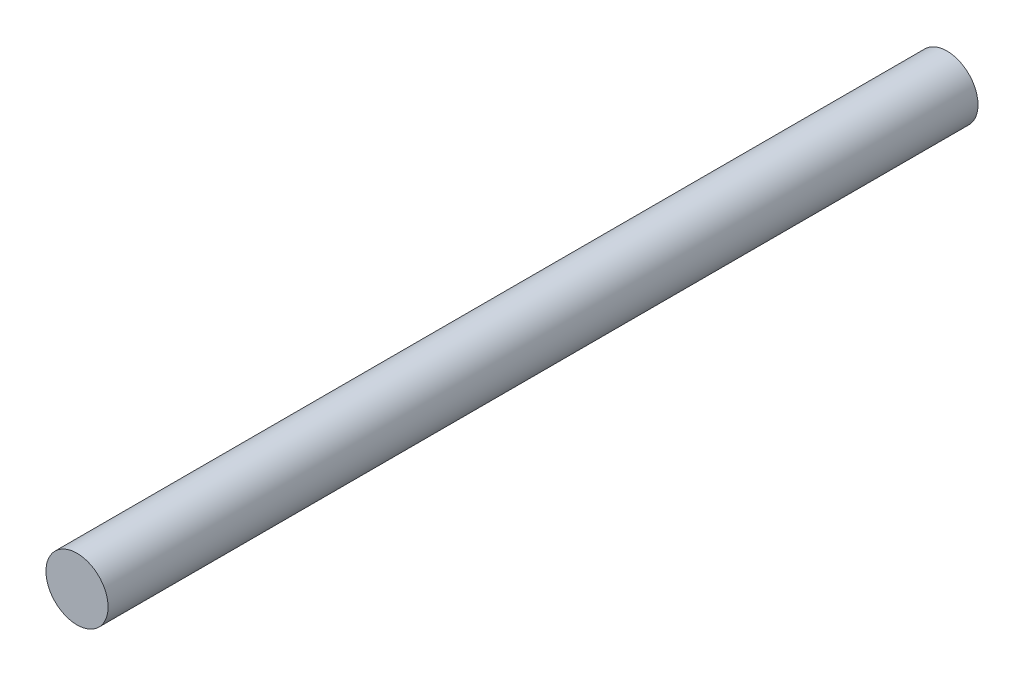
ISO-10303-21;
HEADER;
FILE_DESCRIPTION(('STEP AP214'),'2;1');
FILE_NAME('part.step','',(''),(''),'','','');
FILE_SCHEMA(('AUTOMOTIVE_DESIGN { 1 0 10303 214 1 1 1 1 }'));
ENDSEC;
DATA;
#1=APPLICATION_CONTEXT('core data for automotive mechanical design processes');
#2=APPLICATION_PROTOCOL_DEFINITION('international standard','automotive_design',2000,#1);
#3=PRODUCT_CONTEXT('',#1,'mechanical');
#4=PRODUCT('Part','Part','',(#3));
#5=PRODUCT_RELATED_PRODUCT_CATEGORY('part','',(#4));
#6=PRODUCT_DEFINITION_FORMATION('','',#4);
#7=PRODUCT_DEFINITION_CONTEXT('part definition',#1,'design');
#8=PRODUCT_DEFINITION('design','',#6,#7);
#9=PRODUCT_DEFINITION_SHAPE('','',#8);
#10=(LENGTH_UNIT() NAMED_UNIT(*) SI_UNIT(.MILLI.,.METRE.));
#11=(NAMED_UNIT(*) PLANE_ANGLE_UNIT() SI_UNIT($,.RADIAN.));
#12=(NAMED_UNIT(*) SI_UNIT($,.STERADIAN.) SOLID_ANGLE_UNIT());
#13=UNCERTAINTY_MEASURE_WITH_UNIT(LENGTH_MEASURE(1.E-05),#10,'distance_accuracy_value','');
#14=(GEOMETRIC_REPRESENTATION_CONTEXT(3) GLOBAL_UNCERTAINTY_ASSIGNED_CONTEXT((#13)) GLOBAL_UNIT_ASSIGNED_CONTEXT((#10,
#11,#12)) REPRESENTATION_CONTEXT('',''));
#15=CARTESIAN_POINT('',(0.,0.,0.));
#16=DIRECTION('',(0.,0.,1.));
#17=DIRECTION('',(1.,0.,0.));
#18=AXIS2_PLACEMENT_3D('',#15,#16,#17);
#19=CARTESIAN_POINT('',(0.,0.,35.));
#20=DIRECTION('',(0.,0.,-1.));
#21=DIRECTION('',(-1.,0.,0.));
#22=AXIS2_PLACEMENT_3D('',#19,#20,#21);
#23=CYLINDRICAL_SURFACE('',#22,2.5);
#24=CARTESIAN_POINT('',(0.,0.,35.));
#25=DIRECTION('',(0.,0.,1.));
#26=DIRECTION('',(1.,0.,0.));
#27=AXIS2_PLACEMENT_3D('',#24,#25,#26);
#28=CIRCLE('',#27,2.5);
#29=CARTESIAN_POINT('',(2.5,0.,35.));
#30=VERTEX_POINT('',#29);
#31=EDGE_CURVE('E10',#30,#30,#28,.T.);
#32=ORIENTED_EDGE('',*,*,#31,.F.);
#33=EDGE_LOOP('',(#32));
#34=FACE_BOUND('',#33,.T.);
#35=CARTESIAN_POINT('',(0.,0.,-35.));
#36=DIRECTION('',(0.,0.,1.));
#37=DIRECTION('',(1.,0.,0.));
#38=AXIS2_PLACEMENT_3D('',#35,#36,#37);
#39=CIRCLE('',#38,2.5);
#40=CARTESIAN_POINT('',(2.5,0.,-35.));
#41=VERTEX_POINT('',#40);
#42=EDGE_CURVE('E36',#41,#41,#39,.T.);
#43=ORIENTED_EDGE('',*,*,#42,.T.);
#44=EDGE_LOOP('',(#43));
#45=FACE_BOUND('',#44,.T.);
#46=ADVANCED_FACE('F33',(#34,#45),#23,.T.);
#47=CARTESIAN_POINT('',(0.,0.,35.));
#48=DIRECTION('',(0.,0.,1.));
#49=DIRECTION('',(1.,0.,0.));
#50=AXIS2_PLACEMENT_3D('',#47,#48,#49);
#51=PLANE('',#50);
#52=ORIENTED_EDGE('',*,*,#31,.T.);
#53=EDGE_LOOP('',(#52));
#54=FACE_BOUND('',#53,.T.);
#55=ADVANCED_FACE('F48',(#54),#51,.T.);
#56=CARTESIAN_POINT('',(0.,0.,-35.));
#57=DIRECTION('',(0.,0.,1.));
#58=DIRECTION('',(1.,0.,0.));
#59=AXIS2_PLACEMENT_3D('',#56,#57,#58);
#60=PLANE('',#59);
#61=ORIENTED_EDGE('',*,*,#42,.F.);
#62=EDGE_LOOP('',(#61));
#63=FACE_BOUND('',#62,.T.);
#64=ADVANCED_FACE('F46',(#63),#60,.F.);
#65=CLOSED_SHELL('',(#46,#55,#64));
#66=MANIFOLD_SOLID_BREP('B2',#65);
#67=ADVANCED_BREP_SHAPE_REPRESENTATION('',(#18,#66),#14);
#68=SHAPE_DEFINITION_REPRESENTATION(#9,#67);
ENDSEC;
END-ISO-10303-21;
